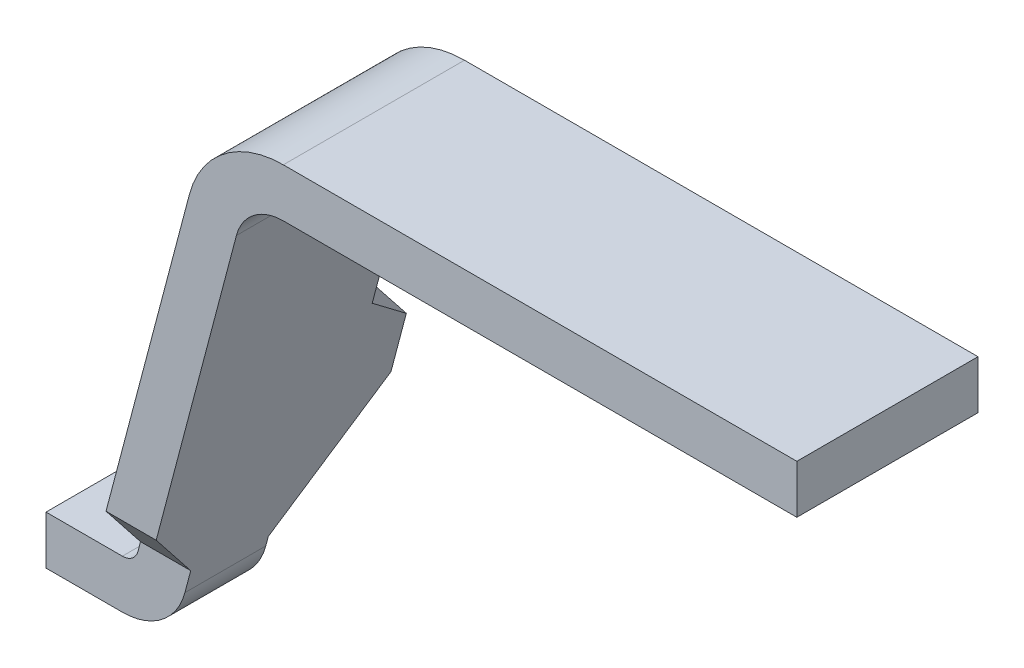
ISO-10303-21;
HEADER;
FILE_DESCRIPTION(('STEP AP214'),'2;1');
FILE_NAME('part.step','',(''),(''),'','','');
FILE_SCHEMA(('AUTOMOTIVE_DESIGN { 1 0 10303 214 1 1 1 1 }'));
ENDSEC;
DATA;
#1=APPLICATION_CONTEXT('core data for automotive mechanical design processes');
#2=APPLICATION_PROTOCOL_DEFINITION('international standard','automotive_design',2000,#1);
#3=PRODUCT_CONTEXT('',#1,'mechanical');
#4=PRODUCT('Part','Part','',(#3));
#5=PRODUCT_RELATED_PRODUCT_CATEGORY('part','',(#4));
#6=PRODUCT_DEFINITION_FORMATION('','',#4);
#7=PRODUCT_DEFINITION_CONTEXT('part definition',#1,'design');
#8=PRODUCT_DEFINITION('design','',#6,#7);
#9=PRODUCT_DEFINITION_SHAPE('','',#8);
#10=(LENGTH_UNIT() NAMED_UNIT(*) SI_UNIT(.MILLI.,.METRE.));
#11=(NAMED_UNIT(*) PLANE_ANGLE_UNIT() SI_UNIT($,.RADIAN.));
#12=(NAMED_UNIT(*) SI_UNIT($,.STERADIAN.) SOLID_ANGLE_UNIT());
#13=UNCERTAINTY_MEASURE_WITH_UNIT(LENGTH_MEASURE(1.E-05),#10,'distance_accuracy_value','');
#14=(GEOMETRIC_REPRESENTATION_CONTEXT(3) GLOBAL_UNCERTAINTY_ASSIGNED_CONTEXT((#13)) GLOBAL_UNIT_ASSIGNED_CONTEXT((#10,
#11,#12)) REPRESENTATION_CONTEXT('',''));
#15=CARTESIAN_POINT('',(0.,0.,0.));
#16=DIRECTION('',(0.,0.,1.));
#17=DIRECTION('',(1.,0.,0.));
#18=AXIS2_PLACEMENT_3D('',#15,#16,#17);
#19=CARTESIAN_POINT('',(-4.4799255523392,-2.75295117219365,1.12));
#20=DIRECTION('',(0.,-1.,0.));
#21=DIRECTION('',(1.,0.,0.));
#22=AXIS2_PLACEMENT_3D('',#19,#20,#21);
#23=PLANE('',#22);
#24=DIRECTION('',(1.,0.,0.));
#25=VECTOR('',#24,1.);
#26=CARTESIAN_POINT('',(-4.95201474498883,-2.75295117219364,0.81));
#27=LINE('',#26,#25);
#28=CARTESIAN_POINT('',(-4.95201474498883,-2.75295117219364,0.81));
#29=VERTEX_POINT('',#28);
#30=CARTESIAN_POINT('',(-4.4799255523392,-2.75295117219364,0.81));
#31=VERTEX_POINT('',#30);
#32=EDGE_CURVE('E225',#29,#31,#27,.T.);
#33=ORIENTED_EDGE('',*,*,#32,.T.);
#34=DIRECTION('',(0.,0.,-1.));
#35=VECTOR('',#34,1.);
#36=CARTESIAN_POINT('',(-4.4799255523392,-2.75295117219364,1.12));
#37=LINE('',#36,#35);
#38=CARTESIAN_POINT('',(-4.4799255523392,-2.75295117219365,0.31));
#39=VERTEX_POINT('',#38);
#40=EDGE_CURVE('E218',#31,#39,#37,.T.);
#41=ORIENTED_EDGE('',*,*,#40,.T.);
#42=DIRECTION('',(1.,0.,0.));
#43=VECTOR('',#42,1.);
#44=CARTESIAN_POINT('',(-4.95201474498883,-2.75295117219365,0.31));
#45=LINE('',#44,#43);
#46=CARTESIAN_POINT('',(-4.95201474498883,-2.75295117219365,0.31));
#47=VERTEX_POINT('',#46);
#48=EDGE_CURVE('E212',#39,#47,#45,.F.);
#49=ORIENTED_EDGE('',*,*,#48,.T.);
#50=DIRECTION('',(0.,0.,-1.));
#51=VECTOR('',#50,1.);
#52=CARTESIAN_POINT('',(-4.95201474498883,-2.75295117219364,1.12));
#53=LINE('',#52,#51);
#54=EDGE_CURVE('E205',#47,#29,#53,.F.);
#55=ORIENTED_EDGE('',*,*,#54,.T.);
#56=EDGE_LOOP('',(#33,#41,#49,#55));
#57=FACE_BOUND('',#56,.T.);
#58=ADVANCED_FACE('F18',(#57),#23,.F.);
#59=CARTESIAN_POINT('',(-4.95201474498883,-2.75295117219364,1.12));
#60=DIRECTION('',(1.,0.,0.));
#61=DIRECTION('',(0.,0.,-1.));
#62=AXIS2_PLACEMENT_3D('',#59,#60,#61);
#63=PLANE('',#62);
#64=DIRECTION('',(0.,1.,0.));
#65=VECTOR('',#64,1.);
#66=CARTESIAN_POINT('',(-4.95201474498883,-2.61932913149392,0.81));
#67=LINE('',#66,#65);
#68=CARTESIAN_POINT('',(-4.95201474498883,-3.05295006080988,0.81));
#69=VERTEX_POINT('',#68);
#70=EDGE_CURVE('E222',#69,#29,#67,.T.);
#71=ORIENTED_EDGE('',*,*,#70,.T.);
#72=ORIENTED_EDGE('',*,*,#54,.F.);
#73=DIRECTION('',(0.,-1.,0.));
#74=VECTOR('',#73,1.);
#75=CARTESIAN_POINT('',(-4.95201474498883,-2.61932913149392,0.31));
#76=LINE('',#75,#74);
#77=CARTESIAN_POINT('',(-4.95201474498883,-3.05295006080988,0.31));
#78=VERTEX_POINT('',#77);
#79=EDGE_CURVE('E208',#47,#78,#76,.T.);
#80=ORIENTED_EDGE('',*,*,#79,.T.);
#81=DIRECTION('',(0.,0.,1.));
#82=VECTOR('',#81,1.);
#83=CARTESIAN_POINT('',(-4.95201474498883,-3.05295006080988,1.12));
#84=LINE('',#83,#82);
#85=EDGE_CURVE('E203',#78,#69,#84,.T.);
#86=ORIENTED_EDGE('',*,*,#85,.T.);
#87=EDGE_LOOP('',(#71,#72,#80,#86));
#88=FACE_BOUND('',#87,.T.);
#89=ADVANCED_FACE('F391',(#88),#63,.F.);
#90=CARTESIAN_POINT('',(-4.47992785115073,-3.05295006080988,1.12));
#91=DIRECTION('',(0.,1.,0.));
#92=DIRECTION('',(0.,0.,1.));
#93=AXIS2_PLACEMENT_3D('',#90,#91,#92);
#94=PLANE('',#93);
#95=DIRECTION('',(1.,0.,0.));
#96=VECTOR('',#95,1.);
#97=CARTESIAN_POINT('',(-4.95201474498883,-3.05295006080988,0.81));
#98=LINE('',#97,#96);
#99=CARTESIAN_POINT('',(-4.4799255523392,-3.05295006081318,0.81));
#100=VERTEX_POINT('',#99);
#101=EDGE_CURVE('E146',#100,#69,#98,.F.);
#102=ORIENTED_EDGE('',*,*,#101,.T.);
#103=ORIENTED_EDGE('',*,*,#85,.F.);
#104=DIRECTION('',(1.,0.,0.));
#105=VECTOR('',#104,1.);
#106=CARTESIAN_POINT('',(-4.95201474498883,-3.05295006080988,0.31));
#107=LINE('',#106,#105);
#108=CARTESIAN_POINT('',(-4.4799255523392,-3.05295006081318,0.31));
#109=VERTEX_POINT('',#108);
#110=EDGE_CURVE('E211',#78,#109,#107,.T.);
#111=ORIENTED_EDGE('',*,*,#110,.T.);
#112=DIRECTION('',(0.,0.,-1.));
#113=VECTOR('',#112,1.);
#114=CARTESIAN_POINT('',(-4.4799255523392,-3.05295006081649,1.12));
#115=LINE('',#114,#113);
#116=EDGE_CURVE('E149',#100,#109,#115,.T.);
#117=ORIENTED_EDGE('',*,*,#116,.F.);
#118=EDGE_LOOP('',(#102,#103,#111,#117));
#119=FACE_BOUND('',#118,.T.);
#120=ADVANCED_FACE('F394',(#119),#94,.F.);
#121=CARTESIAN_POINT('',(-4.4799255523392,-2.65295117219366,1.12));
#122=DIRECTION('',(0.,0.,-1.));
#123=DIRECTION('',(-1.,0.,0.));
#124=AXIS2_PLACEMENT_3D('',#121,#122,#123);
#125=CYLINDRICAL_SURFACE('',#124,0.399998888622822);
#126=ORIENTED_EDGE('',*,*,#116,.T.);
#127=CARTESIAN_POINT('',(-4.4799255523392,-2.65295117219366,0.31));
#128=DIRECTION('',(0.,0.,-1.));
#129=DIRECTION('',(-1.,0.,0.));
#130=AXIS2_PLACEMENT_3D('',#127,#128,#129);
#131=CIRCLE('',#130,0.399998888622822);
#132=CARTESIAN_POINT('',(-4.09316070833002,-2.75499070540402,0.31));
#133=VERTEX_POINT('',#132);
#134=EDGE_CURVE('E163',#109,#133,#131,.F.);
#135=ORIENTED_EDGE('',*,*,#134,.T.);
#136=DIRECTION('',(0.,0.,1.));
#137=VECTOR('',#136,1.);
#138=CARTESIAN_POINT('',(-4.09316078312852,-2.75499098891682,1.12));
#139=LINE('',#138,#137);
#140=CARTESIAN_POINT('',(-4.09316070833002,-2.75499070540402,0.81));
#141=VERTEX_POINT('',#140);
#142=EDGE_CURVE('E155',#133,#141,#139,.T.);
#143=ORIENTED_EDGE('',*,*,#142,.T.);
#144=CARTESIAN_POINT('',(-4.4799255523392,-2.65295117219366,0.81));
#145=DIRECTION('',(0.,0.,-1.));
#146=DIRECTION('',(-1.,0.,0.));
#147=AXIS2_PLACEMENT_3D('',#144,#145,#146);
#148=CIRCLE('',#147,0.399998888622822);
#149=EDGE_CURVE('E21',#141,#100,#148,.T.);
#150=ORIENTED_EDGE('',*,*,#149,.T.);
#151=EDGE_LOOP('',(#126,#135,#143,#150));
#152=FACE_BOUND('',#151,.T.);
#153=ADVANCED_FACE('F161',(#152),#125,.T.);
#154=CARTESIAN_POINT('',(-4.95201474498883,-2.61932913149392,0.81));
#155=DIRECTION('',(0.,0.,-1.));
#156=DIRECTION('',(0.,1.,0.));
#157=AXIS2_PLACEMENT_3D('',#154,#155,#156);
#158=PLANE('',#157);
#159=ORIENTED_EDGE('',*,*,#32,.F.);
#160=ORIENTED_EDGE('',*,*,#70,.F.);
#161=ORIENTED_EDGE('',*,*,#101,.F.);
#162=ORIENTED_EDGE('',*,*,#149,.F.);
#163=DIRECTION('',(-0.255098833021712,-0.966914983538346,0.));
#164=VECTOR('',#163,1.);
#165=CARTESIAN_POINT('',(-3.46485004867951,-0.373470633608013,0.81));
#166=LINE('',#165,#164);
#167=CARTESIAN_POINT('',(-4.05736944458963,-2.61932913149392,0.81));
#168=VERTEX_POINT('',#167);
#169=EDGE_CURVE('E143',#141,#168,#166,.F.);
#170=ORIENTED_EDGE('',*,*,#169,.T.);
#171=DIRECTION('',(1.,0.,0.));
#172=VECTOR('',#171,1.);
#173=CARTESIAN_POINT('',(-4.95201474498883,-2.61932913149392,0.81));
#174=LINE('',#173,#172);
#175=CARTESIAN_POINT('',(-4.36763342201255,-2.61932913149392,0.81));
#176=VERTEX_POINT('',#175);
#177=EDGE_CURVE('E180',#168,#176,#174,.F.);
#178=ORIENTED_EDGE('',*,*,#177,.T.);
#179=DIRECTION('',(0.255098833021717,0.966914983538345,0.));
#180=VECTOR('',#179,1.);
#181=CARTESIAN_POINT('',(-3.75492331953632,-0.296940700186821,0.81));
#182=LINE('',#181,#180);
#183=CARTESIAN_POINT('',(-4.38323405398539,-2.67846105549578,0.81));
#184=VERTEX_POINT('',#183);
#185=EDGE_CURVE('E303',#176,#184,#182,.F.);
#186=ORIENTED_EDGE('',*,*,#185,.T.);
#187=CARTESIAN_POINT('',(-4.4799255523392,-2.65295117219366,0.81));
#188=DIRECTION('',(0.,0.,-1.));
#189=DIRECTION('',(-1.,0.,0.));
#190=AXIS2_PLACEMENT_3D('',#187,#188,#189);
#191=CIRCLE('',#190,0.0999999999999786);
#192=EDGE_CURVE('E221',#184,#31,#191,.T.);
#193=ORIENTED_EDGE('',*,*,#192,.T.);
#194=EDGE_LOOP('',(#159,#160,#161,#162,#170,#178,#186,#193));
#195=FACE_BOUND('',#194,.T.);
#196=ADVANCED_FACE('F142',(#195),#158,.F.);
#197=CARTESIAN_POINT('',(-4.4799255523392,-2.65295117219366,1.12));
#198=DIRECTION('',(0.,0.,-1.));
#199=DIRECTION('',(-1.,0.,0.));
#200=AXIS2_PLACEMENT_3D('',#197,#198,#199);
#201=CYLINDRICAL_SURFACE('',#200,0.0999999999999786);
#202=ORIENTED_EDGE('',*,*,#192,.F.);
#203=DIRECTION('',(0.,0.,1.));
#204=VECTOR('',#203,1.);
#205=CARTESIAN_POINT('',(-4.38323405398538,-2.67846105549574,1.12));
#206=LINE('',#205,#204);
#207=CARTESIAN_POINT('',(-4.38323405398539,-2.67846105549578,0.31));
#208=VERTEX_POINT('',#207);
#209=EDGE_CURVE('E326',#184,#208,#206,.F.);
#210=ORIENTED_EDGE('',*,*,#209,.T.);
#211=CARTESIAN_POINT('',(-4.4799255523392,-2.65295117219366,0.31));
#212=DIRECTION('',(0.,0.,-1.));
#213=DIRECTION('',(-1.,0.,0.));
#214=AXIS2_PLACEMENT_3D('',#211,#212,#213);
#215=CIRCLE('',#214,0.0999999999999786);
#216=EDGE_CURVE('E220',#208,#39,#215,.T.);
#217=ORIENTED_EDGE('',*,*,#216,.T.);
#218=ORIENTED_EDGE('',*,*,#40,.F.);
#219=EDGE_LOOP('',(#202,#210,#217,#218));
#220=FACE_BOUND('',#219,.T.);
#221=ADVANCED_FACE('F387',(#220),#201,.F.);
#222=CARTESIAN_POINT('',(-4.95201474498883,-2.61932913149392,0.31));
#223=DIRECTION('',(0.,0.,1.));
#224=DIRECTION('',(0.,-1.,0.));
#225=AXIS2_PLACEMENT_3D('',#222,#223,#224);
#226=PLANE('',#225);
#227=DIRECTION('',(-0.966914983538346,0.255098833021715,0.));
#228=VECTOR('',#227,1.);
#229=CARTESIAN_POINT('',(-4.07756000155868,-2.69585849788931,0.31));
#230=LINE('',#229,#228);
#231=CARTESIAN_POINT('',(-4.07756000155868,-2.69585849788931,0.31));
#232=VERTEX_POINT('',#231);
#233=CARTESIAN_POINT('',(-4.36763342201255,-2.61932913149392,0.31));
#234=VERTEX_POINT('',#233);
#235=EDGE_CURVE('E185',#232,#234,#230,.T.);
#236=ORIENTED_EDGE('',*,*,#235,.F.);
#237=DIRECTION('',(-0.255098833021712,-0.966914983538346,0.));
#238=VECTOR('',#237,1.);
#239=CARTESIAN_POINT('',(-3.46485004867951,-0.373470633608013,0.31));
#240=LINE('',#239,#238);
#241=EDGE_CURVE('E164',#232,#133,#240,.T.);
#242=ORIENTED_EDGE('',*,*,#241,.T.);
#243=ORIENTED_EDGE('',*,*,#134,.F.);
#244=ORIENTED_EDGE('',*,*,#110,.F.);
#245=ORIENTED_EDGE('',*,*,#79,.F.);
#246=ORIENTED_EDGE('',*,*,#48,.F.);
#247=ORIENTED_EDGE('',*,*,#216,.F.);
#248=DIRECTION('',(0.255098833021717,0.966914983538345,0.));
#249=VECTOR('',#248,1.);
#250=CARTESIAN_POINT('',(-3.75492331953632,-0.296940700186821,0.31));
#251=LINE('',#250,#249);
#252=EDGE_CURVE('E329',#208,#234,#251,.T.);
#253=ORIENTED_EDGE('',*,*,#252,.T.);
#254=EDGE_LOOP('',(#236,#242,#243,#244,#245,#246,#247,#253));
#255=FACE_BOUND('',#254,.T.);
#256=ADVANCED_FACE('F384',(#255),#226,.F.);
#257=CARTESIAN_POINT('',(-2.69972882475407,-3.05936835272429,0.31));
#258=DIRECTION('',(-0.16157225916038,-0.612416123020887,-0.773848109989212));
#259=DIRECTION('',(0.,0.784151162800457,-0.620569862206255));
#260=AXIS2_PLACEMENT_3D('',#257,#258,#259);
#261=PLANE('',#260);
#262=DIRECTION('',(0.197407749794309,0.748245332531399,-0.633371220269854));
#263=VECTOR('',#262,1.);
#264=CARTESIAN_POINT('',(-4.36763342201255,-2.61932913149392,0.31));
#265=LINE('',#264,#263);
#266=CARTESIAN_POINT('',(-4.1874404735359,-1.93633399683883,-0.268138537010811));
#267=VERTEX_POINT('',#266);
#268=EDGE_CURVE('E287',#234,#267,#265,.T.);
#269=ORIENTED_EDGE('',*,*,#268,.T.);
#270=DIRECTION('',(-0.966914983538346,0.255098833021715,0.));
#271=VECTOR('',#270,1.);
#272=CARTESIAN_POINT('',(-3.89736705308203,-2.01286336323422,-0.268138537010811));
#273=LINE('',#272,#271);
#274=CARTESIAN_POINT('',(-3.89736705308203,-2.01286336323422,-0.268138537010811));
#275=VERTEX_POINT('',#274);
#276=EDGE_CURVE('E183',#275,#267,#273,.T.);
#277=ORIENTED_EDGE('',*,*,#276,.F.);
#278=DIRECTION('',(-0.197407749794305,-0.7482453325314,0.633371220269854));
#279=VECTOR('',#278,1.);
#280=CARTESIAN_POINT('',(-3.89736705308203,-2.01286336323422,-0.268138537010811));
#281=LINE('',#280,#279);
#282=EDGE_CURVE('E166',#275,#232,#281,.T.);
#283=ORIENTED_EDGE('',*,*,#282,.T.);
#284=ORIENTED_EDGE('',*,*,#235,.T.);
#285=EDGE_LOOP('',(#269,#277,#283,#284));
#286=FACE_BOUND('',#285,.T.);
#287=ADVANCED_FACE('F382',(#286),#261,.T.);
#288=CARTESIAN_POINT('',(-2.51953587627742,-2.3763732180692,-0.268138537010811));
#289=DIRECTION('',(0.,0.,-1.));
#290=DIRECTION('',(-1.,0.,0.));
#291=AXIS2_PLACEMENT_3D('',#288,#289,#290);
#292=PLANE('',#291);
#293=DIRECTION('',(0.255098833021717,0.966914983538345,0.));
#294=VECTOR('',#293,1.);
#295=CARTESIAN_POINT('',(-3.75492331953632,-0.296940700186821,-0.268138537010811));
#296=LINE('',#295,#294);
#297=CARTESIAN_POINT('',(-4.09251268071589,-1.57652401987953,-0.268138537010811));
#298=VERTEX_POINT('',#297);
#299=EDGE_CURVE('E195',#267,#298,#296,.T.);
#300=ORIENTED_EDGE('',*,*,#299,.T.);
#301=DIRECTION('',(-0.966914983538345,0.255098833021716,0.));
#302=VECTOR('',#301,1.);
#303=CARTESIAN_POINT('',(-3.80243926026203,-1.65305338627492,-0.26813853701081));
#304=LINE('',#303,#302);
#305=CARTESIAN_POINT('',(-3.80243926026203,-1.65305338627492,-0.268138537010811));
#306=VERTEX_POINT('',#305);
#307=EDGE_CURVE('E188',#306,#298,#304,.T.);
#308=ORIENTED_EDGE('',*,*,#307,.F.);
#309=DIRECTION('',(-0.255098833021712,-0.966914983538346,0.));
#310=VECTOR('',#309,1.);
#311=CARTESIAN_POINT('',(-3.46485004867951,-0.373470633608013,-0.268138537010811));
#312=LINE('',#311,#310);
#313=EDGE_CURVE('E175',#306,#275,#312,.T.);
#314=ORIENTED_EDGE('',*,*,#313,.T.);
#315=ORIENTED_EDGE('',*,*,#276,.T.);
#316=EDGE_LOOP('',(#300,#308,#314,#315));
#317=FACE_BOUND('',#316,.T.);
#318=ADVANCED_FACE('F379',(#317),#292,.T.);
#319=CARTESIAN_POINT('',(-4.95201474498883,-2.25295006080988,1.12));
#320=DIRECTION('',(0.,0.645926383382755,-0.763399703464754));
#321=DIRECTION('',(0.,0.763399703464754,0.645926383382755));
#322=AXIS2_PLACEMENT_3D('',#319,#320,#321);
#323=PLANE('',#322);
#324=DIRECTION('',(0.197441163125989,0.74837198090008,0.633211153808228));
#325=VECTOR('',#324,1.);
#326=CARTESIAN_POINT('',(-4.05736944458963,-2.61932913149392,0.81));
#327=LINE('',#326,#325);
#328=CARTESIAN_POINT('',(-3.96070854371802,-2.25295006080988,1.12));
#329=VERTEX_POINT('',#328);
#330=EDGE_CURVE('E159',#168,#329,#327,.T.);
#331=ORIENTED_EDGE('',*,*,#330,.T.);
#332=DIRECTION('',(1.,0.,0.));
#333=VECTOR('',#332,1.);
#334=CARTESIAN_POINT('',(-3.17477555361796,-2.25295006080988,1.12));
#335=LINE('',#334,#333);
#336=CARTESIAN_POINT('',(-4.27097252114093,-2.25295006080988,1.12));
#337=VERTEX_POINT('',#336);
#338=EDGE_CURVE('E299',#337,#329,#335,.T.);
#339=ORIENTED_EDGE('',*,*,#338,.F.);
#340=DIRECTION('',(-0.197441163125993,-0.748371980900079,-0.633211153808228));
#341=VECTOR('',#340,1.);
#342=CARTESIAN_POINT('',(-4.27097252114093,-2.25295006080988,1.12));
#343=LINE('',#342,#341);
#344=EDGE_CURVE('E300',#337,#176,#343,.T.);
#345=ORIENTED_EDGE('',*,*,#344,.T.);
#346=ORIENTED_EDGE('',*,*,#177,.F.);
#347=EDGE_LOOP('',(#331,#339,#345,#346));
#348=FACE_BOUND('',#347,.T.);
#349=ADVANCED_FACE('F349',(#348),#323,.F.);
#350=CARTESIAN_POINT('',(-3.46485004867951,-0.373470633608013,1.12));
#351=DIRECTION('',(-0.966914983538346,0.255098833021712,0.));
#352=DIRECTION('',(-0.255098833021712,-0.966914983538346,0.));
#353=AXIS2_PLACEMENT_3D('',#350,#351,#352);
#354=PLANE('',#353);
#355=DIRECTION('',(-0.255098833021712,-0.966914983538346,0.));
#356=VECTOR('',#355,1.);
#357=CARTESIAN_POINT('',(-3.46485004867951,-0.373470633608013,0.));
#358=LINE('',#357,#356);
#359=CARTESIAN_POINT('',(-3.4648500486795,-0.373470633607985,0.));
#360=VERTEX_POINT('',#359);
#361=CARTESIAN_POINT('',(-3.74531259863371,-1.43652309315809,0.));
#362=VERTEX_POINT('',#361);
#363=EDGE_CURVE('E199',#360,#362,#358,.T.);
#364=ORIENTED_EDGE('',*,*,#363,.F.);
#365=DIRECTION('',(0.,0.,-1.));
#366=VECTOR('',#365,1.);
#367=CARTESIAN_POINT('',(-3.46485004867951,-0.373470633608013,1.12));
#368=LINE('',#367,#366);
#369=CARTESIAN_POINT('',(-3.4648500486795,-0.373470633607985,1.12));
#370=VERTEX_POINT('',#369);
#371=EDGE_CURVE('E266',#360,#370,#368,.F.);
#372=ORIENTED_EDGE('',*,*,#371,.T.);
#373=DIRECTION('',(0.255098833021711,0.966914983538347,0.));
#374=VECTOR('',#373,1.);
#375=CARTESIAN_POINT('',(-3.96070854371802,-2.25295006080988,1.12));
#376=LINE('',#375,#374);
#377=EDGE_CURVE('E244',#329,#370,#376,.T.);
#378=ORIENTED_EDGE('',*,*,#377,.F.);
#379=ORIENTED_EDGE('',*,*,#330,.F.);
#380=ORIENTED_EDGE('',*,*,#169,.F.);
#381=ORIENTED_EDGE('',*,*,#142,.F.);
#382=ORIENTED_EDGE('',*,*,#241,.F.);
#383=ORIENTED_EDGE('',*,*,#282,.F.);
#384=ORIENTED_EDGE('',*,*,#313,.F.);
#385=DIRECTION('',(-0.163521595597803,-0.61980479895868,-0.767530259312908));
#386=VECTOR('',#385,1.);
#387=CARTESIAN_POINT('',(-3.74531259863371,-1.43652309315809,0.));
#388=LINE('',#387,#386);
#389=EDGE_CURVE('E192',#362,#306,#388,.T.);
#390=ORIENTED_EDGE('',*,*,#389,.F.);
#391=EDGE_LOOP('',(#364,#372,#378,#379,#380,#381,#382,#383,#384,#390));
#392=FACE_BOUND('',#391,.T.);
#393=ADVANCED_FACE('F153',(#392),#354,.F.);
#394=CARTESIAN_POINT('',(-3.75492331953632,-0.296940700186821,1.12));
#395=DIRECTION('',(0.966914983538345,-0.255098833021717,0.));
#396=DIRECTION('',(0.255098833021717,0.966914983538345,0.));
#397=AXIS2_PLACEMENT_3D('',#394,#395,#396);
#398=PLANE('',#397);
#399=ORIENTED_EDGE('',*,*,#252,.F.);
#400=ORIENTED_EDGE('',*,*,#209,.F.);
#401=ORIENTED_EDGE('',*,*,#185,.F.);
#402=ORIENTED_EDGE('',*,*,#344,.F.);
#403=DIRECTION('',(-0.255098833021717,-0.966914983538345,0.));
#404=VECTOR('',#403,1.);
#405=CARTESIAN_POINT('',(-3.75492331953632,-0.296940700186821,1.12));
#406=LINE('',#405,#404);
#407=CARTESIAN_POINT('',(-3.75492339433484,-0.296940983699695,1.12));
#408=VERTEX_POINT('',#407);
#409=EDGE_CURVE('E240',#408,#337,#406,.T.);
#410=ORIENTED_EDGE('',*,*,#409,.F.);
#411=DIRECTION('',(0.,0.,-1.));
#412=VECTOR('',#411,1.);
#413=CARTESIAN_POINT('',(-3.75492331953632,-0.296940700186821,1.12));
#414=LINE('',#413,#412);
#415=CARTESIAN_POINT('',(-3.75492339433484,-0.296940983699695,0.));
#416=VERTEX_POINT('',#415);
#417=EDGE_CURVE('E281',#416,#408,#414,.F.);
#418=ORIENTED_EDGE('',*,*,#417,.F.);
#419=DIRECTION('',(0.255098833021717,0.966914983538345,0.));
#420=VECTOR('',#419,1.);
#421=CARTESIAN_POINT('',(-3.75492331953632,-0.296940700186821,0.));
#422=LINE('',#421,#420);
#423=CARTESIAN_POINT('',(-4.03538601908757,-1.3599937267627,0.));
#424=VERTEX_POINT('',#423);
#425=EDGE_CURVE('E198',#424,#416,#422,.T.);
#426=ORIENTED_EDGE('',*,*,#425,.F.);
#427=DIRECTION('',(0.163521595597809,0.619804798958678,0.767530259312908));
#428=VECTOR('',#427,1.);
#429=CARTESIAN_POINT('',(-4.09251268071589,-1.57652401987953,-0.268138537010811));
#430=LINE('',#429,#428);
#431=EDGE_CURVE('E191',#298,#424,#430,.T.);
#432=ORIENTED_EDGE('',*,*,#431,.F.);
#433=ORIENTED_EDGE('',*,*,#299,.F.);
#434=ORIENTED_EDGE('',*,*,#268,.F.);
#435=EDGE_LOOP('',(#399,#400,#401,#402,#410,#418,#426,#432,#433,#434));
#436=FACE_BOUND('',#435,.T.);
#437=ADVANCED_FACE('F344',(#436),#398,.F.);
#438=CARTESIAN_POINT('',(-3.17477325480426,0.149998605103842,1.12));
#439=DIRECTION('',(4.39368777594729E-07,-0.999999999999904,0.));
#440=DIRECTION('',(0.999999999999904,4.39368777594729E-07,0.));
#441=AXIS2_PLACEMENT_3D('',#438,#439,#440);
#442=PLANE('',#441);
#443=DIRECTION('',(0.,0.,-1.));
#444=VECTOR('',#443,1.);
#445=CARTESIAN_POINT('',(-3.17477325480426,0.149998605103842,1.12));
#446=LINE('',#445,#444);
#447=CARTESIAN_POINT('',(-3.17477440421111,0.14999930255197,1.12));
#448=VERTEX_POINT('',#447);
#449=CARTESIAN_POINT('',(-3.17477440421111,0.14999930255197,0.));
#450=VERTEX_POINT('',#449);
#451=EDGE_CURVE('E276',#448,#450,#446,.T.);
#452=ORIENTED_EDGE('',*,*,#451,.F.);
#453=DIRECTION('',(1.,0.,0.));
#454=VECTOR('',#453,1.);
#455=CARTESIAN_POINT('',(-3.17477555361796,0.150000000000098,1.12));
#456=LINE('',#455,#454);
#457=CARTESIAN_POINT('',(2.67906612692881E-08,0.150000000000098,1.12));
#458=VERTEX_POINT('',#457);
#459=EDGE_CURVE('E241',#458,#448,#456,.F.);
#460=ORIENTED_EDGE('',*,*,#459,.F.);
#461=DIRECTION('',(0.,0.,1.));
#462=VECTOR('',#461,1.);
#463=CARTESIAN_POINT('',(2.67906612692881E-08,0.150000000000098,1.12));
#464=LINE('',#463,#462);
#465=CARTESIAN_POINT('',(2.67906612692881E-08,0.150000000000098,0.));
#466=VERTEX_POINT('',#465);
#467=EDGE_CURVE('E236',#458,#466,#464,.F.);
#468=ORIENTED_EDGE('',*,*,#467,.T.);
#469=DIRECTION('',(1.,0.,0.));
#470=VECTOR('',#469,1.);
#471=CARTESIAN_POINT('',(-3.17477555361796,0.150000000000098,0.));
#472=LINE('',#471,#470);
#473=EDGE_CURVE('E232',#466,#450,#472,.F.);
#474=ORIENTED_EDGE('',*,*,#473,.T.);
#475=EDGE_LOOP('',(#452,#460,#468,#474));
#476=FACE_BOUND('',#475,.T.);
#477=ADVANCED_FACE('F368',(#476),#442,.F.);
#478=CARTESIAN_POINT('',(-3.17477555361796,-0.450000283514479,1.12));
#479=DIRECTION('',(0.,0.,-1.));
#480=DIRECTION('',(-1.,0.,0.));
#481=AXIS2_PLACEMENT_3D('',#478,#479,#480);
#482=CYLINDRICAL_SURFACE('',#481,0.599998888622724);
#483=CARTESIAN_POINT('',(-3.17477555361796,-0.450000283514479,1.12));
#484=DIRECTION('',(0.,0.,-1.));
#485=DIRECTION('',(-1.,0.,0.));
#486=AXIS2_PLACEMENT_3D('',#483,#484,#485);
#487=CIRCLE('',#486,0.599998888622724);
#488=EDGE_CURVE('E237',#448,#408,#487,.F.);
#489=ORIENTED_EDGE('',*,*,#488,.F.);
#490=ORIENTED_EDGE('',*,*,#451,.T.);
#491=CARTESIAN_POINT('',(-3.17477555361796,-0.450000283514479,0.));
#492=DIRECTION('',(0.,0.,-1.));
#493=DIRECTION('',(-1.,0.,0.));
#494=AXIS2_PLACEMENT_3D('',#491,#492,#493);
#495=CIRCLE('',#494,0.599998888622724);
#496=EDGE_CURVE('E228',#450,#416,#495,.F.);
#497=ORIENTED_EDGE('',*,*,#496,.T.);
#498=ORIENTED_EDGE('',*,*,#417,.T.);
#499=EDGE_LOOP('',(#489,#490,#497,#498));
#500=FACE_BOUND('',#499,.T.);
#501=ADVANCED_FACE('F369',(#500),#482,.T.);
#502=CARTESIAN_POINT('',(-2.42460808345742,-2.0165632411099,-0.268138537010811));
#503=DIRECTION('',(0.195796073459578,0.742136508048722,-0.641012715192968));
#504=DIRECTION('',(0.,0.653664633609433,0.756784346275903));
#505=AXIS2_PLACEMENT_3D('',#502,#503,#504);
#506=PLANE('',#505);
#507=ORIENTED_EDGE('',*,*,#431,.T.);
#508=DIRECTION('',(0.966914983538345,-0.255098833021717,0.));
#509=VECTOR('',#508,1.);
#510=CARTESIAN_POINT('',(-4.03538601908757,-1.3599937267627,0.));
#511=LINE('',#510,#509);
#512=EDGE_CURVE('E231',#424,#362,#511,.T.);
#513=ORIENTED_EDGE('',*,*,#512,.T.);
#514=ORIENTED_EDGE('',*,*,#389,.T.);
#515=ORIENTED_EDGE('',*,*,#307,.T.);
#516=EDGE_LOOP('',(#507,#513,#514,#515));
#517=FACE_BOUND('',#516,.T.);
#518=ADVANCED_FACE('F373',(#517),#506,.T.);
#519=CARTESIAN_POINT('',(-3.17477555361796,-0.450000283514479,1.12));
#520=DIRECTION('',(0.,0.,-1.));
#521=DIRECTION('',(-1.,0.,0.));
#522=AXIS2_PLACEMENT_3D('',#519,#520,#521);
#523=CYLINDRICAL_SURFACE('',#522,0.300000000000031);
#524=DIRECTION('',(0.,0.,1.));
#525=VECTOR('',#524,1.);
#526=CARTESIAN_POINT('',(-3.17477555361797,-0.150000283514448,1.12));
#527=LINE('',#526,#525);
#528=CARTESIAN_POINT('',(-3.17477555361796,-0.150000283514448,0.));
#529=VERTEX_POINT('',#528);
#530=CARTESIAN_POINT('',(-3.17477555361796,-0.150000283514448,1.12));
#531=VERTEX_POINT('',#530);
#532=EDGE_CURVE('E271',#529,#531,#527,.T.);
#533=ORIENTED_EDGE('',*,*,#532,.T.);
#534=CARTESIAN_POINT('',(-3.17477555361796,-0.450000283514479,1.12));
#535=DIRECTION('',(0.,0.,-1.));
#536=DIRECTION('',(-1.,0.,0.));
#537=AXIS2_PLACEMENT_3D('',#534,#535,#536);
#538=CIRCLE('',#537,0.300000000000031);
#539=EDGE_CURVE('E242',#370,#531,#538,.T.);
#540=ORIENTED_EDGE('',*,*,#539,.F.);
#541=ORIENTED_EDGE('',*,*,#371,.F.);
#542=CARTESIAN_POINT('',(-3.17477555361796,-0.450000283514479,0.));
#543=DIRECTION('',(0.,0.,-1.));
#544=DIRECTION('',(-1.,0.,0.));
#545=AXIS2_PLACEMENT_3D('',#542,#543,#544);
#546=CIRCLE('',#545,0.300000000000031);
#547=EDGE_CURVE('E233',#360,#529,#546,.T.);
#548=ORIENTED_EDGE('',*,*,#547,.T.);
#549=EDGE_LOOP('',(#533,#540,#541,#548));
#550=FACE_BOUND('',#549,.T.);
#551=ADVANCED_FACE('F419',(#550),#523,.F.);
#552=CARTESIAN_POINT('',(-3.17477555361796,-0.450000283514479,1.12));
#553=DIRECTION('',(0.,0.,1.));
#554=DIRECTION('',(1.,0.,0.));
#555=AXIS2_PLACEMENT_3D('',#552,#553,#554);
#556=PLANE('',#555);
#557=ORIENTED_EDGE('',*,*,#488,.T.);
#558=ORIENTED_EDGE('',*,*,#409,.T.);
#559=ORIENTED_EDGE('',*,*,#338,.T.);
#560=ORIENTED_EDGE('',*,*,#377,.T.);
#561=ORIENTED_EDGE('',*,*,#539,.T.);
#562=DIRECTION('',(1.,0.,0.));
#563=VECTOR('',#562,1.);
#564=CARTESIAN_POINT('',(-3.17477555361797,-0.150000283514448,1.12));
#565=LINE('',#564,#563);
#566=CARTESIAN_POINT('',(2.67906612986113E-08,-0.150000283514448,1.12));
#567=VERTEX_POINT('',#566);
#568=EDGE_CURVE('E574',#531,#567,#565,.T.);
#569=ORIENTED_EDGE('',*,*,#568,.T.);
#570=DIRECTION('',(0.,-1.,0.));
#571=VECTOR('',#570,1.);
#572=CARTESIAN_POINT('',(2.67906613572577E-08,-0.150000283514448,1.12));
#573=LINE('',#572,#571);
#574=EDGE_CURVE('E294',#567,#458,#573,.F.);
#575=ORIENTED_EDGE('',*,*,#574,.T.);
#576=ORIENTED_EDGE('',*,*,#459,.T.);
#577=EDGE_LOOP('',(#557,#558,#559,#560,#561,#569,#575,#576));
#578=FACE_BOUND('',#577,.T.);
#579=ADVANCED_FACE('F351',(#578),#556,.T.);
#580=CARTESIAN_POINT('',(2.67906613572577E-08,-0.150000283514448,1.12));
#581=DIRECTION('',(-1.,0.,0.));
#582=DIRECTION('',(0.,-1.,0.));
#583=AXIS2_PLACEMENT_3D('',#580,#581,#582);
#584=PLANE('',#583);
#585=ORIENTED_EDGE('',*,*,#467,.F.);
#586=ORIENTED_EDGE('',*,*,#574,.F.);
#587=DIRECTION('',(0.,0.,1.));
#588=VECTOR('',#587,1.);
#589=CARTESIAN_POINT('',(2.67906612692881E-08,-0.150000283514448,1.12));
#590=LINE('',#589,#588);
#591=CARTESIAN_POINT('',(2.67906612692881E-08,-0.150000283514448,0.));
#592=VERTEX_POINT('',#591);
#593=EDGE_CURVE('E27',#567,#592,#590,.F.);
#594=ORIENTED_EDGE('',*,*,#593,.T.);
#595=DIRECTION('',(0.,1.,0.));
#596=VECTOR('',#595,1.);
#597=CARTESIAN_POINT('',(2.67906612692881E-08,-0.450000283514479,0.));
#598=LINE('',#597,#596);
#599=EDGE_CURVE('E35',#592,#466,#598,.T.);
#600=ORIENTED_EDGE('',*,*,#599,.T.);
#601=EDGE_LOOP('',(#585,#586,#594,#600));
#602=FACE_BOUND('',#601,.T.);
#603=ADVANCED_FACE('F410',(#602),#584,.F.);
#604=CARTESIAN_POINT('',(-3.17477555361796,-0.450000283514479,0.));
#605=DIRECTION('',(0.,0.,1.));
#606=DIRECTION('',(1.,0.,0.));
#607=AXIS2_PLACEMENT_3D('',#604,#605,#606);
#608=PLANE('',#607);
#609=ORIENTED_EDGE('',*,*,#512,.F.);
#610=ORIENTED_EDGE('',*,*,#425,.T.);
#611=ORIENTED_EDGE('',*,*,#496,.F.);
#612=ORIENTED_EDGE('',*,*,#473,.F.);
#613=ORIENTED_EDGE('',*,*,#599,.F.);
#614=DIRECTION('',(1.,0.,0.));
#615=VECTOR('',#614,1.);
#616=CARTESIAN_POINT('',(-3.17477555361797,-0.150000283514448,0.));
#617=LINE('',#616,#615);
#618=EDGE_CURVE('E11',#592,#529,#617,.F.);
#619=ORIENTED_EDGE('',*,*,#618,.T.);
#620=ORIENTED_EDGE('',*,*,#547,.F.);
#621=ORIENTED_EDGE('',*,*,#363,.T.);
#622=EDGE_LOOP('',(#609,#610,#611,#612,#613,#619,#620,#621));
#623=FACE_BOUND('',#622,.T.);
#624=ADVANCED_FACE('F374',(#623),#608,.F.);
#625=CARTESIAN_POINT('',(-3.17477555361797,-0.150000283514448,1.12));
#626=DIRECTION('',(0.,1.,0.));
#627=DIRECTION('',(0.,0.,1.));
#628=AXIS2_PLACEMENT_3D('',#625,#626,#627);
#629=PLANE('',#628);
#630=ORIENTED_EDGE('',*,*,#593,.F.);
#631=ORIENTED_EDGE('',*,*,#568,.F.);
#632=ORIENTED_EDGE('',*,*,#532,.F.);
#633=ORIENTED_EDGE('',*,*,#618,.F.);
#634=EDGE_LOOP('',(#630,#631,#632,#633));
#635=FACE_BOUND('',#634,.T.);
#636=ADVANCED_FACE('F403',(#635),#629,.F.);
#637=CLOSED_SHELL('',(#58,#89,#120,#153,#196,#221,#256,#287,#318,#349,#393,#437,#477,#501,#518,
#551,#579,#603,#624,#636));
#638=MANIFOLD_SOLID_BREP('B1',#637);
#639=ADVANCED_BREP_SHAPE_REPRESENTATION('',(#18,#638),#14);
#640=SHAPE_DEFINITION_REPRESENTATION(#9,#639);
ENDSEC;
END-ISO-10303-21;
